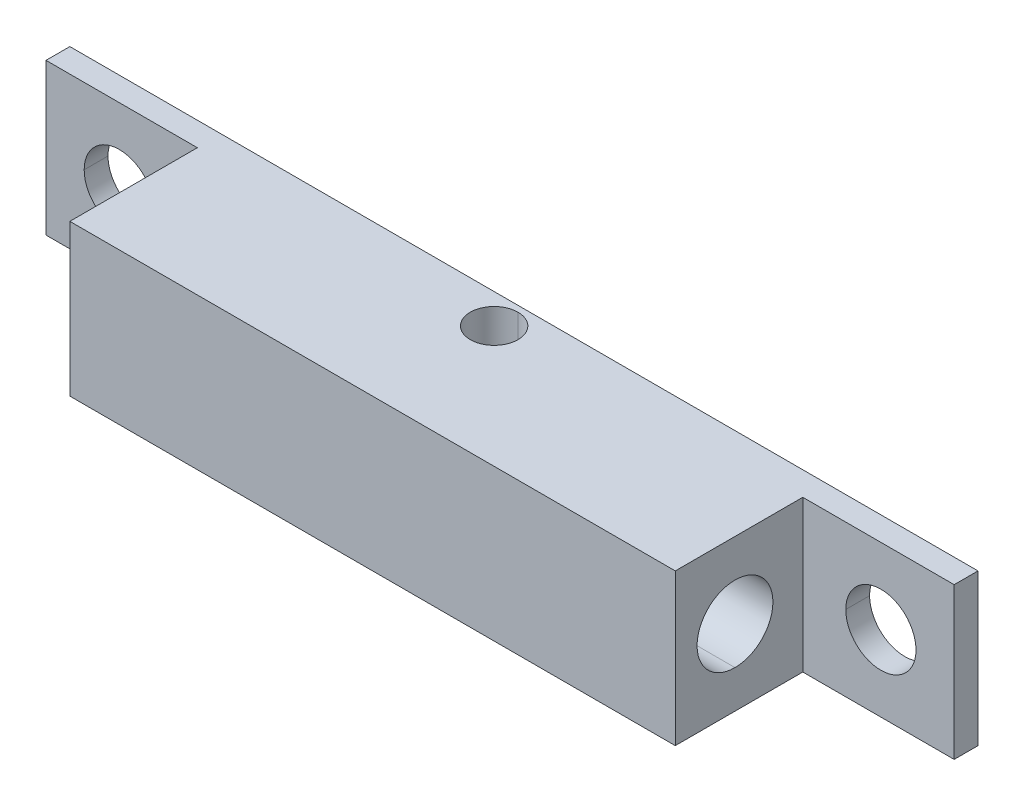
ISO-10303-21;
HEADER;
FILE_DESCRIPTION(('STEP AP214'),'2;1');
FILE_NAME('part.step','',(''),(''),'','','');
FILE_SCHEMA(('AUTOMOTIVE_DESIGN { 1 0 10303 214 1 1 1 1 }'));
ENDSEC;
DATA;
#1=APPLICATION_CONTEXT('core data for automotive mechanical design processes');
#2=APPLICATION_PROTOCOL_DEFINITION('international standard','automotive_design',2000,#1);
#3=PRODUCT_CONTEXT('',#1,'mechanical');
#4=PRODUCT('Part','Part','',(#3));
#5=PRODUCT_RELATED_PRODUCT_CATEGORY('part','',(#4));
#6=PRODUCT_DEFINITION_FORMATION('','',#4);
#7=PRODUCT_DEFINITION_CONTEXT('part definition',#1,'design');
#8=PRODUCT_DEFINITION('design','',#6,#7);
#9=PRODUCT_DEFINITION_SHAPE('','',#8);
#10=(LENGTH_UNIT() NAMED_UNIT(*) SI_UNIT(.MILLI.,.METRE.));
#11=(NAMED_UNIT(*) PLANE_ANGLE_UNIT() SI_UNIT($,.RADIAN.));
#12=(NAMED_UNIT(*) SI_UNIT($,.STERADIAN.) SOLID_ANGLE_UNIT());
#13=UNCERTAINTY_MEASURE_WITH_UNIT(LENGTH_MEASURE(1.E-05),#10,'distance_accuracy_value','');
#14=(GEOMETRIC_REPRESENTATION_CONTEXT(3) GLOBAL_UNCERTAINTY_ASSIGNED_CONTEXT((#13)) GLOBAL_UNIT_ASSIGNED_CONTEXT((#10,
#11,#12)) REPRESENTATION_CONTEXT('',''));
#15=CARTESIAN_POINT('',(0.,0.,0.));
#16=DIRECTION('',(0.,0.,1.));
#17=DIRECTION('',(1.,0.,0.));
#18=AXIS2_PLACEMENT_3D('',#15,#16,#17);
#19=CARTESIAN_POINT('',(12.7,-9.1784271247462,1.25));
#20=DIRECTION('',(0.,1.,0.));
#21=DIRECTION('',(0.,0.,1.));
#22=AXIS2_PLACEMENT_3D('',#19,#20,#21);
#23=CYLINDRICAL_SURFACE('',#22,1.);
#24=DIRECTION('',(0.,1.,0.));
#25=VECTOR('',#24,1.);
#26=CARTESIAN_POINT('',(12.7,-9.1784271247462,0.25));
#27=LINE('',#26,#25);
#28=CARTESIAN_POINT('',(12.7,-6.35,0.25));
#29=VERTEX_POINT('',#28);
#30=CARTESIAN_POINT('',(12.7,0.,0.25));
#31=VERTEX_POINT('',#30);
#32=EDGE_CURVE('E277',#29,#31,#27,.T.);
#33=ORIENTED_EDGE('',*,*,#32,.F.);
#34=CARTESIAN_POINT('',(12.7,-6.35,1.25));
#35=DIRECTION('',(0.,1.,0.));
#36=DIRECTION('',(1.,0.,0.));
#37=AXIS2_PLACEMENT_3D('',#34,#35,#36);
#38=CIRCLE('',#37,1.);
#39=CARTESIAN_POINT('',(12.7,-6.35,2.25));
#40=VERTEX_POINT('',#39);
#41=EDGE_CURVE('E252',#40,#29,#38,.T.);
#42=ORIENTED_EDGE('',*,*,#41,.F.);
#43=DIRECTION('',(0.,1.,0.));
#44=VECTOR('',#43,1.);
#45=CARTESIAN_POINT('',(12.7,-9.1784271247462,2.25));
#46=LINE('',#45,#44);
#47=CARTESIAN_POINT('',(12.7,0.,2.25));
#48=VERTEX_POINT('',#47);
#49=EDGE_CURVE('E256',#40,#48,#46,.T.);
#50=ORIENTED_EDGE('',*,*,#49,.T.);
#51=CARTESIAN_POINT('',(12.7,0.,1.25));
#52=DIRECTION('',(0.,1.,0.));
#53=DIRECTION('',(0.,0.,1.));
#54=AXIS2_PLACEMENT_3D('',#51,#52,#53);
#55=CIRCLE('',#54,1.);
#56=EDGE_CURVE('E207',#48,#31,#55,.T.);
#57=ORIENTED_EDGE('',*,*,#56,.T.);
#58=EDGE_LOOP('',(#33,#42,#50,#57));
#59=FACE_BOUND('',#58,.T.);
#60=ADVANCED_FACE('F15',(#59),#23,.F.);
#61=CARTESIAN_POINT('',(29.9000275554712,-3.175,3.8448));
#62=DIRECTION('',(-1.,0.,0.));
#63=DIRECTION('',(0.,-1.,0.));
#64=AXIS2_PLACEMENT_3D('',#61,#62,#63);
#65=CYLINDRICAL_SURFACE('',#64,1.591);
#66=DIRECTION('',(-1.,0.,0.));
#67=VECTOR('',#66,1.);
#68=CARTESIAN_POINT('',(29.9000275554712,-1.584,3.8448));
#69=LINE('',#68,#67);
#70=CARTESIAN_POINT('',(25.4,-1.584,3.8448));
#71=VERTEX_POINT('',#70);
#72=CARTESIAN_POINT('',(0.,-1.584,3.8448));
#73=VERTEX_POINT('',#72);
#74=EDGE_CURVE('E156',#71,#73,#69,.T.);
#75=ORIENTED_EDGE('',*,*,#74,.F.);
#76=CARTESIAN_POINT('',(25.4,-3.175,3.8448));
#77=DIRECTION('',(-1.,0.,0.));
#78=DIRECTION('',(0.,1.,0.));
#79=AXIS2_PLACEMENT_3D('',#76,#77,#78);
#80=CIRCLE('',#79,1.591);
#81=CARTESIAN_POINT('',(25.4,-4.766,3.8448));
#82=VERTEX_POINT('',#81);
#83=EDGE_CURVE('E149',#82,#71,#80,.T.);
#84=ORIENTED_EDGE('',*,*,#83,.F.);
#85=DIRECTION('',(-1.,0.,0.));
#86=VECTOR('',#85,1.);
#87=CARTESIAN_POINT('',(29.9000275554712,-4.766,3.8448));
#88=LINE('',#87,#86);
#89=CARTESIAN_POINT('',(0.,-4.766,3.8448));
#90=VERTEX_POINT('',#89);
#91=EDGE_CURVE('E147',#82,#90,#88,.T.);
#92=ORIENTED_EDGE('',*,*,#91,.T.);
#93=CARTESIAN_POINT('',(0.,-3.175,3.8448));
#94=DIRECTION('',(-1.,0.,0.));
#95=DIRECTION('',(0.,-1.,0.));
#96=AXIS2_PLACEMENT_3D('',#93,#94,#95);
#97=CIRCLE('',#96,1.591);
#98=EDGE_CURVE('E134',#90,#73,#97,.T.);
#99=ORIENTED_EDGE('',*,*,#98,.T.);
#100=EDGE_LOOP('',(#75,#84,#92,#99));
#101=FACE_BOUND('',#100,.T.);
#102=ADVANCED_FACE('F148',(#101),#65,.F.);
#103=CARTESIAN_POINT('',(0.,0.,1.));
#104=DIRECTION('',(0.,0.,1.));
#105=DIRECTION('',(1.,0.,0.));
#106=AXIS2_PLACEMENT_3D('',#103,#104,#105);
#107=PLANE('',#106);
#108=CARTESIAN_POINT('',(28.675,-3.175,1.));
#109=DIRECTION('',(0.,0.,1.));
#110=DIRECTION('',(1.,0.,0.));
#111=AXIS2_PLACEMENT_3D('',#108,#109,#110);
#112=CIRCLE('',#111,1.4732);
#113=CARTESIAN_POINT('',(27.2018,-3.175,1.));
#114=VERTEX_POINT('',#113);
#115=CARTESIAN_POINT('',(30.1482,-3.175,1.));
#116=VERTEX_POINT('',#115);
#117=EDGE_CURVE('E154',#114,#116,#112,.T.);
#118=ORIENTED_EDGE('',*,*,#117,.F.);
#119=CARTESIAN_POINT('',(28.675,-3.175,1.));
#120=DIRECTION('',(0.,0.,1.));
#121=DIRECTION('',(1.,0.,0.));
#122=AXIS2_PLACEMENT_3D('',#119,#120,#121);
#123=CIRCLE('',#122,1.4732);
#124=EDGE_CURVE('E10',#116,#114,#123,.T.);
#125=ORIENTED_EDGE('',*,*,#124,.F.);
#126=EDGE_LOOP('',(#118,#125));
#127=FACE_BOUND('',#126,.T.);
#128=DIRECTION('',(0.,-1.,0.));
#129=VECTOR('',#128,1.);
#130=CARTESIAN_POINT('',(31.75,0.,1.));
#131=LINE('',#130,#129);
#132=CARTESIAN_POINT('',(31.75,0.,1.));
#133=VERTEX_POINT('',#132);
#134=CARTESIAN_POINT('',(31.75,-6.35,1.));
#135=VERTEX_POINT('',#134);
#136=EDGE_CURVE('E26',#133,#135,#131,.T.);
#137=ORIENTED_EDGE('',*,*,#136,.F.);
#138=DIRECTION('',(1.,0.,0.));
#139=VECTOR('',#138,1.);
#140=CARTESIAN_POINT('',(0.,0.,1.));
#141=LINE('',#140,#139);
#142=CARTESIAN_POINT('',(25.4,0.,1.));
#143=VERTEX_POINT('',#142);
#144=EDGE_CURVE('E208',#143,#133,#141,.T.);
#145=ORIENTED_EDGE('',*,*,#144,.F.);
#146=DIRECTION('',(0.,-1.,0.));
#147=VECTOR('',#146,1.);
#148=CARTESIAN_POINT('',(25.4,0.,1.));
#149=LINE('',#148,#147);
#150=CARTESIAN_POINT('',(25.4,-6.35,1.));
#151=VERTEX_POINT('',#150);
#152=EDGE_CURVE('E143',#143,#151,#149,.T.);
#153=ORIENTED_EDGE('',*,*,#152,.T.);
#154=DIRECTION('',(1.,0.,0.));
#155=VECTOR('',#154,1.);
#156=CARTESIAN_POINT('',(0.,-6.35,1.));
#157=LINE('',#156,#155);
#158=EDGE_CURVE('E172',#151,#135,#157,.T.);
#159=ORIENTED_EDGE('',*,*,#158,.T.);
#160=EDGE_LOOP('',(#137,#145,#153,#159));
#161=FACE_BOUND('',#160,.T.);
#162=ADVANCED_FACE('F503',(#127,#161),#107,.T.);
#163=CARTESIAN_POINT('',(28.675,-3.175,1.));
#164=DIRECTION('',(0.,0.,-1.));
#165=DIRECTION('',(-1.,0.,0.));
#166=AXIS2_PLACEMENT_3D('',#163,#164,#165);
#167=CYLINDRICAL_SURFACE('',#166,1.4732);
#168=DIRECTION('',(0.,0.,-1.));
#169=VECTOR('',#168,1.);
#170=CARTESIAN_POINT('',(30.1482,-3.175,1.));
#171=LINE('',#170,#169);
#172=CARTESIAN_POINT('',(30.1482,-3.175,0.));
#173=VERTEX_POINT('',#172);
#174=EDGE_CURVE('E169',#116,#173,#171,.T.);
#175=ORIENTED_EDGE('',*,*,#174,.F.);
#176=ORIENTED_EDGE('',*,*,#124,.T.);
#177=DIRECTION('',(0.,0.,-1.));
#178=VECTOR('',#177,1.);
#179=CARTESIAN_POINT('',(27.2018,-3.175,1.));
#180=LINE('',#179,#178);
#181=CARTESIAN_POINT('',(27.2018,-3.175,0.));
#182=VERTEX_POINT('',#181);
#183=EDGE_CURVE('E261',#114,#182,#180,.T.);
#184=ORIENTED_EDGE('',*,*,#183,.T.);
#185=CARTESIAN_POINT('',(28.675,-3.175,0.));
#186=DIRECTION('',(0.,0.,1.));
#187=DIRECTION('',(1.,0.,0.));
#188=AXIS2_PLACEMENT_3D('',#185,#186,#187);
#189=CIRCLE('',#188,1.4732);
#190=EDGE_CURVE('E242',#173,#182,#189,.T.);
#191=ORIENTED_EDGE('',*,*,#190,.F.);
#192=EDGE_LOOP('',(#175,#176,#184,#191));
#193=FACE_BOUND('',#192,.T.);
#194=ADVANCED_FACE('F588',(#193),#167,.F.);
#195=CARTESIAN_POINT('',(31.75,0.,1.));
#196=DIRECTION('',(1.,0.,0.));
#197=DIRECTION('',(0.,1.,0.));
#198=AXIS2_PLACEMENT_3D('',#195,#196,#197);
#199=PLANE('',#198);
#200=DIRECTION('',(0.,-1.,0.));
#201=VECTOR('',#200,1.);
#202=CARTESIAN_POINT('',(31.75,0.,0.));
#203=LINE('',#202,#201);
#204=CARTESIAN_POINT('',(31.75,0.,0.));
#205=VERTEX_POINT('',#204);
#206=CARTESIAN_POINT('',(31.75,-6.35,0.));
#207=VERTEX_POINT('',#206);
#208=EDGE_CURVE('E267',#205,#207,#203,.T.);
#209=ORIENTED_EDGE('',*,*,#208,.F.);
#210=DIRECTION('',(0.,0.,-1.));
#211=VECTOR('',#210,1.);
#212=CARTESIAN_POINT('',(31.75,0.,1.));
#213=LINE('',#212,#211);
#214=EDGE_CURVE('E203',#133,#205,#213,.T.);
#215=ORIENTED_EDGE('',*,*,#214,.F.);
#216=ORIENTED_EDGE('',*,*,#136,.T.);
#217=DIRECTION('',(0.,0.,-1.));
#218=VECTOR('',#217,1.);
#219=CARTESIAN_POINT('',(31.75,-6.35,1.));
#220=LINE('',#219,#218);
#221=EDGE_CURVE('E176',#135,#207,#220,.T.);
#222=ORIENTED_EDGE('',*,*,#221,.T.);
#223=EDGE_LOOP('',(#209,#215,#216,#222));
#224=FACE_BOUND('',#223,.T.);
#225=ADVANCED_FACE('F583',(#224),#199,.T.);
#226=CARTESIAN_POINT('',(0.,0.,6.35));
#227=DIRECTION('',(0.,0.,1.));
#228=DIRECTION('',(1.,0.,0.));
#229=AXIS2_PLACEMENT_3D('',#226,#227,#228);
#230=PLANE('',#229);
#231=DIRECTION('',(0.,-1.,0.));
#232=VECTOR('',#231,1.);
#233=CARTESIAN_POINT('',(25.4,0.,6.35));
#234=LINE('',#233,#232);
#235=CARTESIAN_POINT('',(25.4,0.,6.35));
#236=VERTEX_POINT('',#235);
#237=CARTESIAN_POINT('',(25.4,-6.35,6.35));
#238=VERTEX_POINT('',#237);
#239=EDGE_CURVE('E248',#236,#238,#234,.T.);
#240=ORIENTED_EDGE('',*,*,#239,.F.);
#241=DIRECTION('',(1.,0.,0.));
#242=VECTOR('',#241,1.);
#243=CARTESIAN_POINT('',(0.,0.,6.35));
#244=LINE('',#243,#242);
#245=CARTESIAN_POINT('',(0.,0.,6.35));
#246=VERTEX_POINT('',#245);
#247=EDGE_CURVE('E221',#246,#236,#244,.T.);
#248=ORIENTED_EDGE('',*,*,#247,.F.);
#249=DIRECTION('',(0.,-1.,0.));
#250=VECTOR('',#249,1.);
#251=CARTESIAN_POINT('',(0.,0.,6.35));
#252=LINE('',#251,#250);
#253=CARTESIAN_POINT('',(0.,-6.35,6.35));
#254=VERTEX_POINT('',#253);
#255=EDGE_CURVE('E144',#246,#254,#252,.T.);
#256=ORIENTED_EDGE('',*,*,#255,.T.);
#257=DIRECTION('',(1.,0.,0.));
#258=VECTOR('',#257,1.);
#259=CARTESIAN_POINT('',(0.,-6.35,6.35));
#260=LINE('',#259,#258);
#261=EDGE_CURVE('E186',#254,#238,#260,.T.);
#262=ORIENTED_EDGE('',*,*,#261,.T.);
#263=EDGE_LOOP('',(#240,#248,#256,#262));
#264=FACE_BOUND('',#263,.T.);
#265=ADVANCED_FACE('F587',(#264),#230,.T.);
#266=CARTESIAN_POINT('',(25.4,0.,6.35));
#267=DIRECTION('',(1.,0.,0.));
#268=DIRECTION('',(0.,-1.,0.));
#269=AXIS2_PLACEMENT_3D('',#266,#267,#268);
#270=PLANE('',#269);
#271=ORIENTED_EDGE('',*,*,#83,.T.);
#272=CARTESIAN_POINT('',(25.4,-3.175,3.8448));
#273=DIRECTION('',(-1.,0.,0.));
#274=DIRECTION('',(0.,1.,0.));
#275=AXIS2_PLACEMENT_3D('',#272,#273,#274);
#276=CIRCLE('',#275,1.591);
#277=EDGE_CURVE('E163',#71,#82,#276,.T.);
#278=ORIENTED_EDGE('',*,*,#277,.T.);
#279=EDGE_LOOP('',(#271,#278));
#280=FACE_BOUND('',#279,.T.);
#281=ORIENTED_EDGE('',*,*,#152,.F.);
#282=DIRECTION('',(0.,0.,-1.));
#283=VECTOR('',#282,1.);
#284=CARTESIAN_POINT('',(25.4,0.,6.35));
#285=LINE('',#284,#283);
#286=EDGE_CURVE('E217',#236,#143,#285,.T.);
#287=ORIENTED_EDGE('',*,*,#286,.F.);
#288=ORIENTED_EDGE('',*,*,#239,.T.);
#289=DIRECTION('',(0.,0.,-1.));
#290=VECTOR('',#289,1.);
#291=CARTESIAN_POINT('',(25.4,-6.35,6.35));
#292=LINE('',#291,#290);
#293=EDGE_CURVE('E175',#238,#151,#292,.T.);
#294=ORIENTED_EDGE('',*,*,#293,.T.);
#295=EDGE_LOOP('',(#281,#287,#288,#294));
#296=FACE_BOUND('',#295,.T.);
#297=ADVANCED_FACE('F542',(#280,#296),#270,.T.);
#298=CARTESIAN_POINT('',(0.,0.,6.35));
#299=DIRECTION('',(1.,0.,0.));
#300=DIRECTION('',(0.,1.,0.));
#301=AXIS2_PLACEMENT_3D('',#298,#299,#300);
#302=PLANE('',#301);
#303=ORIENTED_EDGE('',*,*,#98,.F.);
#304=CARTESIAN_POINT('',(0.,-3.175,3.8448));
#305=DIRECTION('',(-1.,0.,0.));
#306=DIRECTION('',(0.,-1.,0.));
#307=AXIS2_PLACEMENT_3D('',#304,#305,#306);
#308=CIRCLE('',#307,1.591);
#309=EDGE_CURVE('E138',#73,#90,#308,.T.);
#310=ORIENTED_EDGE('',*,*,#309,.F.);
#311=EDGE_LOOP('',(#303,#310));
#312=FACE_BOUND('',#311,.T.);
#313=DIRECTION('',(0.,0.,-1.));
#314=VECTOR('',#313,1.);
#315=CARTESIAN_POINT('',(0.,0.,6.35));
#316=LINE('',#315,#314);
#317=CARTESIAN_POINT('',(0.,0.,1.));
#318=VERTEX_POINT('',#317);
#319=EDGE_CURVE('E236',#246,#318,#316,.T.);
#320=ORIENTED_EDGE('',*,*,#319,.T.);
#321=DIRECTION('',(0.,-1.,0.));
#322=VECTOR('',#321,1.);
#323=CARTESIAN_POINT('',(0.,0.,1.));
#324=LINE('',#323,#322);
#325=CARTESIAN_POINT('',(0.,-6.35,1.));
#326=VERTEX_POINT('',#325);
#327=EDGE_CURVE('E41',#318,#326,#324,.T.);
#328=ORIENTED_EDGE('',*,*,#327,.T.);
#329=DIRECTION('',(0.,0.,-1.));
#330=VECTOR('',#329,1.);
#331=CARTESIAN_POINT('',(0.,-6.35,6.35));
#332=LINE('',#331,#330);
#333=EDGE_CURVE('E253',#254,#326,#332,.T.);
#334=ORIENTED_EDGE('',*,*,#333,.F.);
#335=ORIENTED_EDGE('',*,*,#255,.F.);
#336=EDGE_LOOP('',(#320,#328,#334,#335));
#337=FACE_BOUND('',#336,.T.);
#338=ADVANCED_FACE('F136',(#312,#337),#302,.F.);
#339=CARTESIAN_POINT('',(0.,0.,0.));
#340=DIRECTION('',(0.,0.,1.));
#341=DIRECTION('',(1.,0.,0.));
#342=AXIS2_PLACEMENT_3D('',#339,#340,#341);
#343=PLANE('',#342);
#344=CARTESIAN_POINT('',(28.675,-3.175,0.));
#345=DIRECTION('',(0.,0.,1.));
#346=DIRECTION('',(1.,0.,0.));
#347=AXIS2_PLACEMENT_3D('',#344,#345,#346);
#348=CIRCLE('',#347,1.4732);
#349=EDGE_CURVE('E167',#182,#173,#348,.T.);
#350=ORIENTED_EDGE('',*,*,#349,.T.);
#351=ORIENTED_EDGE('',*,*,#190,.T.);
#352=EDGE_LOOP('',(#350,#351));
#353=FACE_BOUND('',#352,.T.);
#354=CARTESIAN_POINT('',(-3.275,-3.175,0.));
#355=DIRECTION('',(0.,0.,1.));
#356=DIRECTION('',(1.,0.,0.));
#357=AXIS2_PLACEMENT_3D('',#354,#355,#356);
#358=CIRCLE('',#357,1.4732);
#359=CARTESIAN_POINT('',(-4.7482,-3.175,0.));
#360=VERTEX_POINT('',#359);
#361=CARTESIAN_POINT('',(-1.8018,-3.175,0.));
#362=VERTEX_POINT('',#361);
#363=EDGE_CURVE('E222',#360,#362,#358,.T.);
#364=ORIENTED_EDGE('',*,*,#363,.T.);
#365=CARTESIAN_POINT('',(-3.275,-3.175,0.));
#366=DIRECTION('',(0.,0.,1.));
#367=DIRECTION('',(1.,0.,0.));
#368=AXIS2_PLACEMENT_3D('',#365,#366,#367);
#369=CIRCLE('',#368,1.4732);
#370=EDGE_CURVE('E214',#362,#360,#369,.T.);
#371=ORIENTED_EDGE('',*,*,#370,.T.);
#372=EDGE_LOOP('',(#364,#371));
#373=FACE_BOUND('',#372,.T.);
#374=DIRECTION('',(-1.,0.,0.));
#375=VECTOR('',#374,1.);
#376=CARTESIAN_POINT('',(0.,0.,0.));
#377=LINE('',#376,#375);
#378=CARTESIAN_POINT('',(-6.35,0.,0.));
#379=VERTEX_POINT('',#378);
#380=EDGE_CURVE('E231',#205,#379,#377,.T.);
#381=ORIENTED_EDGE('',*,*,#380,.F.);
#382=ORIENTED_EDGE('',*,*,#208,.T.);
#383=DIRECTION('',(-1.,0.,0.));
#384=VECTOR('',#383,1.);
#385=CARTESIAN_POINT('',(0.,-6.35,0.));
#386=LINE('',#385,#384);
#387=CARTESIAN_POINT('',(-6.35,-6.35,0.));
#388=VERTEX_POINT('',#387);
#389=EDGE_CURVE('E189',#207,#388,#386,.T.);
#390=ORIENTED_EDGE('',*,*,#389,.T.);
#391=DIRECTION('',(0.,-1.,0.));
#392=VECTOR('',#391,1.);
#393=CARTESIAN_POINT('',(-6.35,0.,0.));
#394=LINE('',#393,#392);
#395=EDGE_CURVE('E213',#379,#388,#394,.T.);
#396=ORIENTED_EDGE('',*,*,#395,.F.);
#397=EDGE_LOOP('',(#381,#382,#390,#396));
#398=FACE_BOUND('',#397,.T.);
#399=ADVANCED_FACE('F333',(#353,#373,#398),#343,.F.);
#400=CARTESIAN_POINT('',(0.,0.,1.));
#401=DIRECTION('',(0.,0.,1.));
#402=DIRECTION('',(1.,0.,0.));
#403=AXIS2_PLACEMENT_3D('',#400,#401,#402);
#404=PLANE('',#403);
#405=CARTESIAN_POINT('',(-3.275,-3.175,1.));
#406=DIRECTION('',(0.,0.,1.));
#407=DIRECTION('',(1.,0.,0.));
#408=AXIS2_PLACEMENT_3D('',#405,#406,#407);
#409=CIRCLE('',#408,1.4732);
#410=CARTESIAN_POINT('',(-4.7482,-3.175,1.));
#411=VERTEX_POINT('',#410);
#412=CARTESIAN_POINT('',(-1.8018,-3.175,1.));
#413=VERTEX_POINT('',#412);
#414=EDGE_CURVE('E257',#411,#413,#409,.T.);
#415=ORIENTED_EDGE('',*,*,#414,.F.);
#416=CARTESIAN_POINT('',(-3.275,-3.175,1.));
#417=DIRECTION('',(0.,0.,1.));
#418=DIRECTION('',(1.,0.,0.));
#419=AXIS2_PLACEMENT_3D('',#416,#417,#418);
#420=CIRCLE('',#419,1.4732);
#421=EDGE_CURVE('E19',#413,#411,#420,.T.);
#422=ORIENTED_EDGE('',*,*,#421,.F.);
#423=EDGE_LOOP('',(#415,#422));
#424=FACE_BOUND('',#423,.T.);
#425=DIRECTION('',(-1.,0.,0.));
#426=VECTOR('',#425,1.);
#427=CARTESIAN_POINT('',(0.,0.,1.));
#428=LINE('',#427,#426);
#429=CARTESIAN_POINT('',(-6.35,0.,1.));
#430=VERTEX_POINT('',#429);
#431=EDGE_CURVE('E239',#318,#430,#428,.T.);
#432=ORIENTED_EDGE('',*,*,#431,.T.);
#433=DIRECTION('',(0.,-1.,0.));
#434=VECTOR('',#433,1.);
#435=CARTESIAN_POINT('',(-6.35,0.,1.));
#436=LINE('',#435,#434);
#437=CARTESIAN_POINT('',(-6.35,-6.35,1.));
#438=VERTEX_POINT('',#437);
#439=EDGE_CURVE('E197',#430,#438,#436,.T.);
#440=ORIENTED_EDGE('',*,*,#439,.T.);
#441=DIRECTION('',(-1.,0.,0.));
#442=VECTOR('',#441,1.);
#443=CARTESIAN_POINT('',(0.,-6.35,1.));
#444=LINE('',#443,#442);
#445=EDGE_CURVE('E249',#326,#438,#444,.T.);
#446=ORIENTED_EDGE('',*,*,#445,.F.);
#447=ORIENTED_EDGE('',*,*,#327,.F.);
#448=EDGE_LOOP('',(#432,#440,#446,#447));
#449=FACE_BOUND('',#448,.T.);
#450=ADVANCED_FACE('F322',(#424,#449),#404,.T.);
#451=CARTESIAN_POINT('',(-3.275,-3.175,1.));
#452=DIRECTION('',(0.,0.,-1.));
#453=DIRECTION('',(-1.,0.,0.));
#454=AXIS2_PLACEMENT_3D('',#451,#452,#453);
#455=CYLINDRICAL_SURFACE('',#454,1.4732);
#456=DIRECTION('',(0.,0.,-1.));
#457=VECTOR('',#456,1.);
#458=CARTESIAN_POINT('',(-1.8018,-3.175,1.));
#459=LINE('',#458,#457);
#460=EDGE_CURVE('E227',#413,#362,#459,.T.);
#461=ORIENTED_EDGE('',*,*,#460,.F.);
#462=ORIENTED_EDGE('',*,*,#421,.T.);
#463=DIRECTION('',(0.,0.,-1.));
#464=VECTOR('',#463,1.);
#465=CARTESIAN_POINT('',(-4.7482,-3.175,1.));
#466=LINE('',#465,#464);
#467=EDGE_CURVE('E226',#411,#360,#466,.T.);
#468=ORIENTED_EDGE('',*,*,#467,.T.);
#469=ORIENTED_EDGE('',*,*,#370,.F.);
#470=EDGE_LOOP('',(#461,#462,#468,#469));
#471=FACE_BOUND('',#470,.T.);
#472=ADVANCED_FACE('F326',(#471),#455,.F.);
#473=CARTESIAN_POINT('',(0.,-6.35,1.));
#474=DIRECTION('',(0.,-1.,0.));
#475=DIRECTION('',(-1.,0.,0.));
#476=AXIS2_PLACEMENT_3D('',#473,#474,#475);
#477=PLANE('',#476);
#478=ORIENTED_EDGE('',*,*,#41,.T.);
#479=CARTESIAN_POINT('',(12.7,-6.35,1.25));
#480=DIRECTION('',(0.,1.,0.));
#481=DIRECTION('',(1.,0.,0.));
#482=AXIS2_PLACEMENT_3D('',#479,#480,#481);
#483=CIRCLE('',#482,1.);
#484=EDGE_CURVE('E201',#29,#40,#483,.T.);
#485=ORIENTED_EDGE('',*,*,#484,.T.);
#486=EDGE_LOOP('',(#478,#485));
#487=FACE_BOUND('',#486,.T.);
#488=ORIENTED_EDGE('',*,*,#389,.F.);
#489=ORIENTED_EDGE('',*,*,#221,.F.);
#490=ORIENTED_EDGE('',*,*,#158,.F.);
#491=ORIENTED_EDGE('',*,*,#293,.F.);
#492=ORIENTED_EDGE('',*,*,#261,.F.);
#493=ORIENTED_EDGE('',*,*,#333,.T.);
#494=ORIENTED_EDGE('',*,*,#445,.T.);
#495=DIRECTION('',(0.,0.,-1.));
#496=VECTOR('',#495,1.);
#497=CARTESIAN_POINT('',(-6.35,-6.35,1.));
#498=LINE('',#497,#496);
#499=EDGE_CURVE('E209',#438,#388,#498,.T.);
#500=ORIENTED_EDGE('',*,*,#499,.T.);
#501=EDGE_LOOP('',(#488,#489,#490,#491,#492,#493,#494,#500));
#502=FACE_BOUND('',#501,.T.);
#503=ADVANCED_FACE('F512',(#487,#502),#477,.T.);
#504=CARTESIAN_POINT('',(-6.35,0.,1.));
#505=DIRECTION('',(1.,0.,0.));
#506=DIRECTION('',(0.,-1.,0.));
#507=AXIS2_PLACEMENT_3D('',#504,#505,#506);
#508=PLANE('',#507);
#509=ORIENTED_EDGE('',*,*,#395,.T.);
#510=ORIENTED_EDGE('',*,*,#499,.F.);
#511=ORIENTED_EDGE('',*,*,#439,.F.);
#512=DIRECTION('',(0.,0.,-1.));
#513=VECTOR('',#512,1.);
#514=CARTESIAN_POINT('',(-6.35,0.,1.));
#515=LINE('',#514,#513);
#516=EDGE_CURVE('E235',#430,#379,#515,.T.);
#517=ORIENTED_EDGE('',*,*,#516,.T.);
#518=EDGE_LOOP('',(#509,#510,#511,#517));
#519=FACE_BOUND('',#518,.T.);
#520=ADVANCED_FACE('F531',(#519),#508,.F.);
#521=CARTESIAN_POINT('',(0.,0.,1.));
#522=DIRECTION('',(0.,-1.,0.));
#523=DIRECTION('',(0.,0.,-1.));
#524=AXIS2_PLACEMENT_3D('',#521,#522,#523);
#525=PLANE('',#524);
#526=ORIENTED_EDGE('',*,*,#56,.F.);
#527=CARTESIAN_POINT('',(12.7,0.,1.25));
#528=DIRECTION('',(0.,1.,0.));
#529=DIRECTION('',(0.,0.,1.));
#530=AXIS2_PLACEMENT_3D('',#527,#528,#529);
#531=CIRCLE('',#530,1.);
#532=EDGE_CURVE('E274',#31,#48,#531,.T.);
#533=ORIENTED_EDGE('',*,*,#532,.F.);
#534=EDGE_LOOP('',(#526,#533));
#535=FACE_BOUND('',#534,.T.);
#536=ORIENTED_EDGE('',*,*,#380,.T.);
#537=ORIENTED_EDGE('',*,*,#516,.F.);
#538=ORIENTED_EDGE('',*,*,#431,.F.);
#539=ORIENTED_EDGE('',*,*,#319,.F.);
#540=ORIENTED_EDGE('',*,*,#247,.T.);
#541=ORIENTED_EDGE('',*,*,#286,.T.);
#542=ORIENTED_EDGE('',*,*,#144,.T.);
#543=ORIENTED_EDGE('',*,*,#214,.T.);
#544=EDGE_LOOP('',(#536,#537,#538,#539,#540,#541,#542,#543));
#545=FACE_BOUND('',#544,.T.);
#546=ADVANCED_FACE('F298',(#535,#545),#525,.F.);
#547=CARTESIAN_POINT('',(-3.275,-3.175,1.));
#548=DIRECTION('',(0.,0.,-1.));
#549=DIRECTION('',(-1.,0.,0.));
#550=AXIS2_PLACEMENT_3D('',#547,#548,#549);
#551=CYLINDRICAL_SURFACE('',#550,1.4732);
#552=ORIENTED_EDGE('',*,*,#414,.T.);
#553=ORIENTED_EDGE('',*,*,#460,.T.);
#554=ORIENTED_EDGE('',*,*,#363,.F.);
#555=ORIENTED_EDGE('',*,*,#467,.F.);
#556=EDGE_LOOP('',(#552,#553,#554,#555));
#557=FACE_BOUND('',#556,.T.);
#558=ADVANCED_FACE('F331',(#557),#551,.F.);
#559=CARTESIAN_POINT('',(28.675,-3.175,1.));
#560=DIRECTION('',(0.,0.,-1.));
#561=DIRECTION('',(-1.,0.,0.));
#562=AXIS2_PLACEMENT_3D('',#559,#560,#561);
#563=CYLINDRICAL_SURFACE('',#562,1.4732);
#564=ORIENTED_EDGE('',*,*,#117,.T.);
#565=ORIENTED_EDGE('',*,*,#174,.T.);
#566=ORIENTED_EDGE('',*,*,#349,.F.);
#567=ORIENTED_EDGE('',*,*,#183,.F.);
#568=EDGE_LOOP('',(#564,#565,#566,#567));
#569=FACE_BOUND('',#568,.T.);
#570=ADVANCED_FACE('F494',(#569),#563,.F.);
#571=CARTESIAN_POINT('',(29.9000275554712,-3.175,3.8448));
#572=DIRECTION('',(-1.,0.,0.));
#573=DIRECTION('',(0.,-1.,0.));
#574=AXIS2_PLACEMENT_3D('',#571,#572,#573);
#575=CYLINDRICAL_SURFACE('',#574,1.591);
#576=ORIENTED_EDGE('',*,*,#277,.F.);
#577=ORIENTED_EDGE('',*,*,#74,.T.);
#578=ORIENTED_EDGE('',*,*,#309,.T.);
#579=ORIENTED_EDGE('',*,*,#91,.F.);
#580=EDGE_LOOP('',(#576,#577,#578,#579));
#581=FACE_BOUND('',#580,.T.);
#582=ADVANCED_FACE('F17',(#581),#575,.F.);
#583=CARTESIAN_POINT('',(12.7,-9.1784271247462,1.25));
#584=DIRECTION('',(0.,1.,0.));
#585=DIRECTION('',(0.,0.,1.));
#586=AXIS2_PLACEMENT_3D('',#583,#584,#585);
#587=CYLINDRICAL_SURFACE('',#586,1.);
#588=ORIENTED_EDGE('',*,*,#484,.F.);
#589=ORIENTED_EDGE('',*,*,#32,.T.);
#590=ORIENTED_EDGE('',*,*,#532,.T.);
#591=ORIENTED_EDGE('',*,*,#49,.F.);
#592=EDGE_LOOP('',(#588,#589,#590,#591));
#593=FACE_BOUND('',#592,.T.);
#594=ADVANCED_FACE('F296',(#593),#587,.F.);
#595=CLOSED_SHELL('',(#60,#102,#162,#194,#225,#265,#297,#338,#399,#450,#472,#503,#520,#546,#558,
#570,#582,#594));
#596=MANIFOLD_SOLID_BREP('B1',#595);
#597=ADVANCED_BREP_SHAPE_REPRESENTATION('',(#18,#596),#14);
#598=SHAPE_DEFINITION_REPRESENTATION(#9,#597);
ENDSEC;
END-ISO-10303-21;
